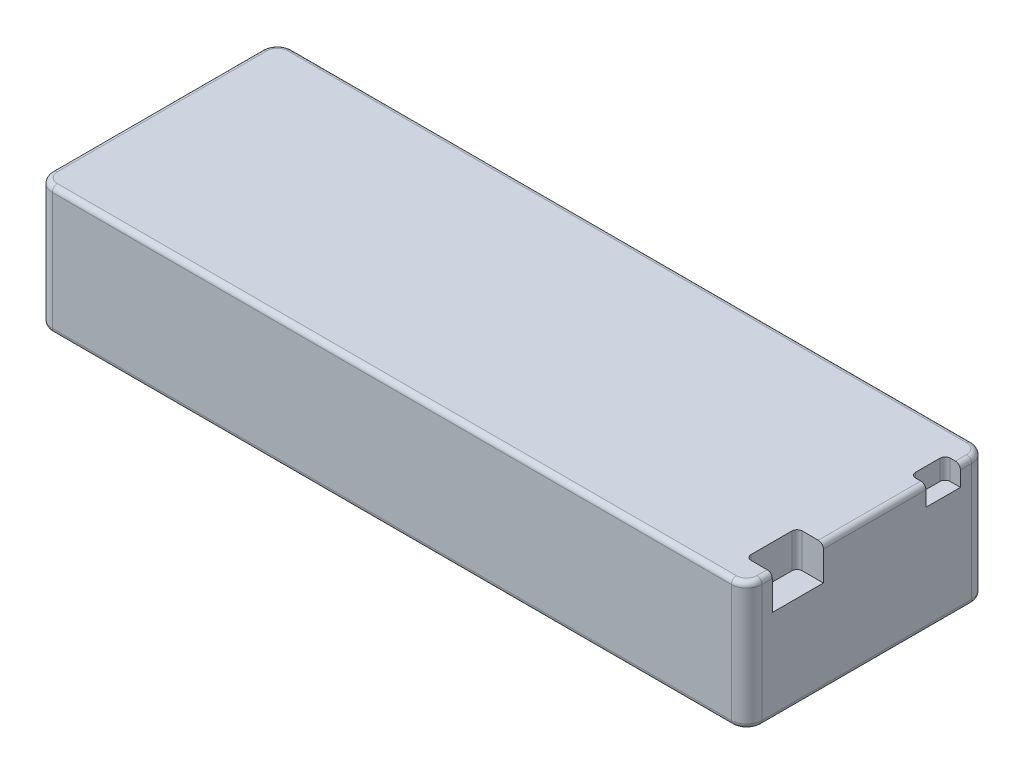
ISO-10303-21;
HEADER;
FILE_DESCRIPTION(('STEP AP214'),'2;1');
FILE_NAME('part.step','',(''),(''),'','','');
FILE_SCHEMA(('AUTOMOTIVE_DESIGN { 1 0 10303 214 1 1 1 1 }'));
ENDSEC;
DATA;
#1=APPLICATION_CONTEXT('core data for automotive mechanical design processes');
#2=APPLICATION_PROTOCOL_DEFINITION('international standard','automotive_design',2000,#1);
#3=PRODUCT_CONTEXT('',#1,'mechanical');
#4=PRODUCT('Part','Part','',(#3));
#5=PRODUCT_RELATED_PRODUCT_CATEGORY('part','',(#4));
#6=PRODUCT_DEFINITION_FORMATION('','',#4);
#7=PRODUCT_DEFINITION_CONTEXT('part definition',#1,'design');
#8=PRODUCT_DEFINITION('design','',#6,#7);
#9=PRODUCT_DEFINITION_SHAPE('','',#8);
#10=(LENGTH_UNIT() NAMED_UNIT(*) SI_UNIT(.MILLI.,.METRE.));
#11=(NAMED_UNIT(*) PLANE_ANGLE_UNIT() SI_UNIT($,.RADIAN.));
#12=(NAMED_UNIT(*) SI_UNIT($,.STERADIAN.) SOLID_ANGLE_UNIT());
#13=UNCERTAINTY_MEASURE_WITH_UNIT(LENGTH_MEASURE(1.E-05),#10,'distance_accuracy_value','');
#14=(GEOMETRIC_REPRESENTATION_CONTEXT(3) GLOBAL_UNCERTAINTY_ASSIGNED_CONTEXT((#13)) GLOBAL_UNIT_ASSIGNED_CONTEXT((#10,
#11,#12)) REPRESENTATION_CONTEXT('',''));
#15=CARTESIAN_POINT('',(0.,0.,0.));
#16=DIRECTION('',(0.,0.,1.));
#17=DIRECTION('',(1.,0.,0.));
#18=AXIS2_PLACEMENT_3D('',#15,#16,#17);
#19=CARTESIAN_POINT('',(-69.4,25.,23.5));
#20=DIRECTION('',(0.,0.,-1.));
#21=DIRECTION('',(-1.,0.,0.));
#22=AXIS2_PLACEMENT_3D('',#19,#20,#21);
#23=PLANE('',#22);
#24=DIRECTION('',(0.,-1.,0.));
#25=VECTOR('',#24,1.);
#26=CARTESIAN_POINT('',(-66.4,0.,23.5));
#27=LINE('',#26,#25);
#28=CARTESIAN_POINT('',(-66.4,24.,23.5));
#29=VERTEX_POINT('',#28);
#30=CARTESIAN_POINT('',(-66.4,1.,23.5));
#31=VERTEX_POINT('',#30);
#32=EDGE_CURVE('E343',#29,#31,#27,.T.);
#33=ORIENTED_EDGE('',*,*,#32,.T.);
#34=DIRECTION('',(1.,0.,0.));
#35=VECTOR('',#34,1.);
#36=CARTESIAN_POINT('',(-69.4,1.,23.5));
#37=LINE('',#36,#35);
#38=CARTESIAN_POINT('',(66.4,1.,23.5));
#39=VERTEX_POINT('',#38);
#40=EDGE_CURVE('E474',#31,#39,#37,.T.);
#41=ORIENTED_EDGE('',*,*,#40,.T.);
#42=DIRECTION('',(0.,-1.,0.));
#43=VECTOR('',#42,1.);
#44=CARTESIAN_POINT('',(66.4,25.,23.5));
#45=LINE('',#44,#43);
#46=CARTESIAN_POINT('',(66.4,24.,23.5));
#47=VERTEX_POINT('',#46);
#48=EDGE_CURVE('E347',#39,#47,#45,.F.);
#49=ORIENTED_EDGE('',*,*,#48,.T.);
#50=DIRECTION('',(1.,0.,0.));
#51=VECTOR('',#50,1.);
#52=CARTESIAN_POINT('',(-66.4,24.,23.5));
#53=LINE('',#52,#51);
#54=EDGE_CURVE('E471',#47,#29,#53,.F.);
#55=ORIENTED_EDGE('',*,*,#54,.T.);
#56=EDGE_LOOP('',(#33,#41,#49,#55));
#57=FACE_BOUND('',#56,.T.);
#58=ADVANCED_FACE('F47',(#57),#23,.F.);
#59=CARTESIAN_POINT('',(69.4,25.,23.5));
#60=DIRECTION('',(-1.,0.,0.));
#61=DIRECTION('',(0.,0.,1.));
#62=AXIS2_PLACEMENT_3D('',#59,#60,#61);
#63=PLANE('',#62);
#64=DIRECTION('',(0.,-1.,0.));
#65=VECTOR('',#64,1.);
#66=CARTESIAN_POINT('',(69.4,25.,20.5));
#67=LINE('',#66,#65);
#68=CARTESIAN_POINT('',(69.4,24.,20.5));
#69=VERTEX_POINT('',#68);
#70=CARTESIAN_POINT('',(69.4,1.,20.5));
#71=VERTEX_POINT('',#70);
#72=EDGE_CURVE('E336',#69,#71,#67,.T.);
#73=ORIENTED_EDGE('',*,*,#72,.T.);
#74=DIRECTION('',(0.,0.,-1.));
#75=VECTOR('',#74,1.);
#76=CARTESIAN_POINT('',(69.4,1.,23.5));
#77=LINE('',#76,#75);
#78=CARTESIAN_POINT('',(69.4,1.,-20.5));
#79=VERTEX_POINT('',#78);
#80=EDGE_CURVE('E416',#71,#79,#77,.T.);
#81=ORIENTED_EDGE('',*,*,#80,.T.);
#82=DIRECTION('',(0.,-1.,0.));
#83=VECTOR('',#82,1.);
#84=CARTESIAN_POINT('',(69.4,25.,-20.5));
#85=LINE('',#84,#83);
#86=CARTESIAN_POINT('',(69.4,24.,-20.5));
#87=VERTEX_POINT('',#86);
#88=EDGE_CURVE('E339',#79,#87,#85,.F.);
#89=ORIENTED_EDGE('',*,*,#88,.T.);
#90=DIRECTION('',(0.,0.,-1.));
#91=VECTOR('',#90,1.);
#92=CARTESIAN_POINT('',(69.4,24.,-18.3));
#93=LINE('',#92,#91);
#94=CARTESIAN_POINT('',(69.4,24.,-18.3));
#95=VERTEX_POINT('',#94);
#96=EDGE_CURVE('E413',#87,#95,#93,.F.);
#97=ORIENTED_EDGE('',*,*,#96,.T.);
#98=DIRECTION('',(0.,1.,0.));
#99=VECTOR('',#98,1.);
#100=CARTESIAN_POINT('',(69.4,25.,-18.3));
#101=LINE('',#100,#99);
#102=CARTESIAN_POINT('',(69.4,21.05,-18.3));
#103=VERTEX_POINT('',#102);
#104=EDGE_CURVE('E272',#103,#95,#101,.T.);
#105=ORIENTED_EDGE('',*,*,#104,.F.);
#106=DIRECTION('',(0.,0.,-1.));
#107=VECTOR('',#106,1.);
#108=CARTESIAN_POINT('',(69.4,21.05,-11.55));
#109=LINE('',#108,#107);
#110=CARTESIAN_POINT('',(69.4,21.05,-11.55));
#111=VERTEX_POINT('',#110);
#112=EDGE_CURVE('E250',#111,#103,#109,.T.);
#113=ORIENTED_EDGE('',*,*,#112,.F.);
#114=DIRECTION('',(0.,-1.,0.));
#115=VECTOR('',#114,1.);
#116=CARTESIAN_POINT('',(69.4,25.,-11.55));
#117=LINE('',#116,#115);
#118=CARTESIAN_POINT('',(69.4,24.,-11.55));
#119=VERTEX_POINT('',#118);
#120=EDGE_CURVE('E260',#119,#111,#117,.T.);
#121=ORIENTED_EDGE('',*,*,#120,.F.);
#122=DIRECTION('',(0.,0.,-1.));
#123=VECTOR('',#122,1.);
#124=CARTESIAN_POINT('',(69.4,24.,8.49999999999999));
#125=LINE('',#124,#123);
#126=CARTESIAN_POINT('',(69.4,24.,8.49999999999999));
#127=VERTEX_POINT('',#126);
#128=EDGE_CURVE('E407',#119,#127,#125,.F.);
#129=ORIENTED_EDGE('',*,*,#128,.T.);
#130=DIRECTION('',(0.,1.,0.));
#131=VECTOR('',#130,1.);
#132=CARTESIAN_POINT('',(69.4,25.,8.49999999999999));
#133=LINE('',#132,#131);
#134=CARTESIAN_POINT('',(69.4,18.25,8.49999999999999));
#135=VERTEX_POINT('',#134);
#136=EDGE_CURVE('E294',#135,#127,#133,.T.);
#137=ORIENTED_EDGE('',*,*,#136,.F.);
#138=DIRECTION('',(0.,0.,-1.));
#139=VECTOR('',#138,1.);
#140=CARTESIAN_POINT('',(69.4,18.25,18.5));
#141=LINE('',#140,#139);
#142=CARTESIAN_POINT('',(69.4,18.25,18.5));
#143=VERTEX_POINT('',#142);
#144=EDGE_CURVE('E302',#143,#135,#141,.T.);
#145=ORIENTED_EDGE('',*,*,#144,.F.);
#146=DIRECTION('',(0.,-1.,0.));
#147=VECTOR('',#146,1.);
#148=CARTESIAN_POINT('',(69.4,25.,18.5));
#149=LINE('',#148,#147);
#150=CARTESIAN_POINT('',(69.4,24.,18.5));
#151=VERTEX_POINT('',#150);
#152=EDGE_CURVE('E283',#151,#143,#149,.T.);
#153=ORIENTED_EDGE('',*,*,#152,.F.);
#154=DIRECTION('',(0.,0.,-1.));
#155=VECTOR('',#154,1.);
#156=CARTESIAN_POINT('',(69.4,24.,20.5));
#157=LINE('',#156,#155);
#158=EDGE_CURVE('E410',#151,#69,#157,.F.);
#159=ORIENTED_EDGE('',*,*,#158,.T.);
#160=EDGE_LOOP('',(#73,#81,#89,#97,#105,#113,#121,#129,#137,#145,#153,#159));
#161=FACE_BOUND('',#160,.T.);
#162=ADVANCED_FACE('F270',(#161),#63,.F.);
#163=CARTESIAN_POINT('',(-69.4,25.,-23.5));
#164=DIRECTION('',(0.,0.,-1.));
#165=DIRECTION('',(-1.,0.,0.));
#166=AXIS2_PLACEMENT_3D('',#163,#164,#165);
#167=PLANE('',#166);
#168=DIRECTION('',(0.,-1.,0.));
#169=VECTOR('',#168,1.);
#170=CARTESIAN_POINT('',(66.4,0.,-23.5));
#171=LINE('',#170,#169);
#172=CARTESIAN_POINT('',(66.4,24.,-23.5));
#173=VERTEX_POINT('',#172);
#174=CARTESIAN_POINT('',(66.4,1.,-23.5));
#175=VERTEX_POINT('',#174);
#176=EDGE_CURVE('E328',#173,#175,#171,.T.);
#177=ORIENTED_EDGE('',*,*,#176,.T.);
#178=DIRECTION('',(1.,0.,0.));
#179=VECTOR('',#178,1.);
#180=CARTESIAN_POINT('',(-66.4,1.,-23.5));
#181=LINE('',#180,#179);
#182=CARTESIAN_POINT('',(-66.4,1.,-23.5));
#183=VERTEX_POINT('',#182);
#184=EDGE_CURVE('E398',#175,#183,#181,.F.);
#185=ORIENTED_EDGE('',*,*,#184,.T.);
#186=DIRECTION('',(0.,-1.,0.));
#187=VECTOR('',#186,1.);
#188=CARTESIAN_POINT('',(-66.4,25.,-23.5));
#189=LINE('',#188,#187);
#190=CARTESIAN_POINT('',(-66.4,24.,-23.5));
#191=VERTEX_POINT('',#190);
#192=EDGE_CURVE('E332',#183,#191,#189,.F.);
#193=ORIENTED_EDGE('',*,*,#192,.T.);
#194=DIRECTION('',(1.,0.,0.));
#195=VECTOR('',#194,1.);
#196=CARTESIAN_POINT('',(-69.4,24.,-23.5));
#197=LINE('',#196,#195);
#198=EDGE_CURVE('E395',#191,#173,#197,.T.);
#199=ORIENTED_EDGE('',*,*,#198,.T.);
#200=EDGE_LOOP('',(#177,#185,#193,#199));
#201=FACE_BOUND('',#200,.T.);
#202=ADVANCED_FACE('F667',(#201),#167,.T.);
#203=CARTESIAN_POINT('',(-69.4,25.,23.5));
#204=DIRECTION('',(-1.,0.,0.));
#205=DIRECTION('',(0.,0.,1.));
#206=AXIS2_PLACEMENT_3D('',#203,#204,#205);
#207=PLANE('',#206);
#208=DIRECTION('',(0.,-1.,0.));
#209=VECTOR('',#208,1.);
#210=CARTESIAN_POINT('',(-69.4,25.,-20.5));
#211=LINE('',#210,#209);
#212=CARTESIAN_POINT('',(-69.4,24.,-20.5));
#213=VERTEX_POINT('',#212);
#214=CARTESIAN_POINT('',(-69.4,1.,-20.5));
#215=VERTEX_POINT('',#214);
#216=EDGE_CURVE('E324',#213,#215,#211,.T.);
#217=ORIENTED_EDGE('',*,*,#216,.T.);
#218=DIRECTION('',(0.,0.,-1.));
#219=VECTOR('',#218,1.);
#220=CARTESIAN_POINT('',(-69.4,1.,20.5));
#221=LINE('',#220,#219);
#222=CARTESIAN_POINT('',(-69.4,1.,20.5));
#223=VERTEX_POINT('',#222);
#224=EDGE_CURVE('E386',#215,#223,#221,.F.);
#225=ORIENTED_EDGE('',*,*,#224,.T.);
#226=DIRECTION('',(0.,-1.,0.));
#227=VECTOR('',#226,1.);
#228=CARTESIAN_POINT('',(-69.4,25.,20.5));
#229=LINE('',#228,#227);
#230=CARTESIAN_POINT('',(-69.4,24.,20.5));
#231=VERTEX_POINT('',#230);
#232=EDGE_CURVE('E312',#223,#231,#229,.F.);
#233=ORIENTED_EDGE('',*,*,#232,.T.);
#234=DIRECTION('',(0.,0.,-1.));
#235=VECTOR('',#234,1.);
#236=CARTESIAN_POINT('',(-69.4,24.,23.5));
#237=LINE('',#236,#235);
#238=EDGE_CURVE('E383',#231,#213,#237,.T.);
#239=ORIENTED_EDGE('',*,*,#238,.T.);
#240=EDGE_LOOP('',(#217,#225,#233,#239));
#241=FACE_BOUND('',#240,.T.);
#242=ADVANCED_FACE('F917',(#241),#207,.T.);
#243=CARTESIAN_POINT('',(0.,25.,0.));
#244=DIRECTION('',(0.,1.,0.));
#245=DIRECTION('',(0.,0.,1.));
#246=AXIS2_PLACEMENT_3D('',#243,#244,#245);
#247=PLANE('',#246);
#248=DIRECTION('',(0.,0.,1.));
#249=VECTOR('',#248,1.);
#250=CARTESIAN_POINT('',(64.25,25.,18.5));
#251=LINE('',#250,#249);
#252=CARTESIAN_POINT('',(64.25,25.,9.49999999999999));
#253=VERTEX_POINT('',#252);
#254=CARTESIAN_POINT('',(64.25,25.,17.5));
#255=VERTEX_POINT('',#254);
#256=EDGE_CURVE('E293',#253,#255,#251,.T.);
#257=ORIENTED_EDGE('',*,*,#256,.F.);
#258=CARTESIAN_POINT('',(65.25,25.,9.49999999999999));
#259=DIRECTION('',(0.,1.,0.));
#260=DIRECTION('',(0.,0.,1.));
#261=AXIS2_PLACEMENT_3D('',#258,#259,#260);
#262=CIRCLE('',#261,1.);
#263=CARTESIAN_POINT('',(65.25,25.,8.49999999999999));
#264=VERTEX_POINT('',#263);
#265=EDGE_CURVE('E56',#253,#264,#262,.F.);
#266=ORIENTED_EDGE('',*,*,#265,.T.);
#267=DIRECTION('',(1.,0.,0.));
#268=VECTOR('',#267,1.);
#269=CARTESIAN_POINT('',(64.25,25.,8.49999999999999));
#270=LINE('',#269,#268);
#271=CARTESIAN_POINT('',(68.4,25.,8.49999999999999));
#272=VERTEX_POINT('',#271);
#273=EDGE_CURVE('E313',#264,#272,#270,.T.);
#274=ORIENTED_EDGE('',*,*,#273,.T.);
#275=DIRECTION('',(0.,0.,-1.));
#276=VECTOR('',#275,1.);
#277=CARTESIAN_POINT('',(68.4,25.,-11.55));
#278=LINE('',#277,#276);
#279=CARTESIAN_POINT('',(68.4,25.,-11.55));
#280=VERTEX_POINT('',#279);
#281=EDGE_CURVE('E454',#272,#280,#278,.T.);
#282=ORIENTED_EDGE('',*,*,#281,.T.);
#283=DIRECTION('',(1.,0.,0.));
#284=VECTOR('',#283,1.);
#285=CARTESIAN_POINT('',(66.4,25.,-11.55));
#286=LINE('',#285,#284);
#287=CARTESIAN_POINT('',(67.4,25.,-11.55));
#288=VERTEX_POINT('',#287);
#289=EDGE_CURVE('E280',#288,#280,#286,.T.);
#290=ORIENTED_EDGE('',*,*,#289,.F.);
#291=CARTESIAN_POINT('',(67.4,25.,-12.55));
#292=DIRECTION('',(0.,1.,0.));
#293=DIRECTION('',(0.,0.,1.));
#294=AXIS2_PLACEMENT_3D('',#291,#292,#293);
#295=CIRCLE('',#294,1.);
#296=CARTESIAN_POINT('',(66.4,25.,-12.55));
#297=VERTEX_POINT('',#296);
#298=EDGE_CURVE('E574',#288,#297,#295,.F.);
#299=ORIENTED_EDGE('',*,*,#298,.T.);
#300=DIRECTION('',(0.,0.,1.));
#301=VECTOR('',#300,1.);
#302=CARTESIAN_POINT('',(66.4,25.,-11.55));
#303=LINE('',#302,#301);
#304=CARTESIAN_POINT('',(66.4,25.,-17.3));
#305=VERTEX_POINT('',#304);
#306=EDGE_CURVE('E257',#305,#297,#303,.T.);
#307=ORIENTED_EDGE('',*,*,#306,.F.);
#308=CARTESIAN_POINT('',(67.4,25.,-17.3));
#309=DIRECTION('',(0.,1.,0.));
#310=DIRECTION('',(0.,0.,1.));
#311=AXIS2_PLACEMENT_3D('',#308,#309,#310);
#312=CIRCLE('',#311,1.);
#313=CARTESIAN_POINT('',(67.4,25.,-18.3));
#314=VERTEX_POINT('',#313);
#315=EDGE_CURVE('E577',#305,#314,#312,.F.);
#316=ORIENTED_EDGE('',*,*,#315,.T.);
#317=DIRECTION('',(1.,0.,0.));
#318=VECTOR('',#317,1.);
#319=CARTESIAN_POINT('',(66.4,25.,-18.3));
#320=LINE('',#319,#318);
#321=CARTESIAN_POINT('',(68.4,25.,-18.3));
#322=VERTEX_POINT('',#321);
#323=EDGE_CURVE('E284',#314,#322,#320,.T.);
#324=ORIENTED_EDGE('',*,*,#323,.T.);
#325=DIRECTION('',(0.,0.,-1.));
#326=VECTOR('',#325,1.);
#327=CARTESIAN_POINT('',(68.4,25.,-20.5));
#328=LINE('',#327,#326);
#329=CARTESIAN_POINT('',(68.4,25.,-20.5));
#330=VERTEX_POINT('',#329);
#331=EDGE_CURVE('E450',#322,#330,#328,.T.);
#332=ORIENTED_EDGE('',*,*,#331,.T.);
#333=CARTESIAN_POINT('',(66.4,25.,-20.5));
#334=DIRECTION('',(0.,1.,0.));
#335=DIRECTION('',(0.,0.,1.));
#336=AXIS2_PLACEMENT_3D('',#333,#334,#335);
#337=CIRCLE('',#336,2.);
#338=CARTESIAN_POINT('',(66.4,25.,-22.5));
#339=VERTEX_POINT('',#338);
#340=EDGE_CURVE('E447',#330,#339,#337,.T.);
#341=ORIENTED_EDGE('',*,*,#340,.T.);
#342=DIRECTION('',(1.,0.,0.));
#343=VECTOR('',#342,1.);
#344=CARTESIAN_POINT('',(0.,25.,-22.5));
#345=LINE('',#344,#343);
#346=CARTESIAN_POINT('',(-66.4,25.,-22.5));
#347=VERTEX_POINT('',#346);
#348=EDGE_CURVE('E444',#339,#347,#345,.F.);
#349=ORIENTED_EDGE('',*,*,#348,.T.);
#350=CARTESIAN_POINT('',(-66.4,25.,-20.5));
#351=DIRECTION('',(0.,1.,0.));
#352=DIRECTION('',(0.,0.,1.));
#353=AXIS2_PLACEMENT_3D('',#350,#351,#352);
#354=CIRCLE('',#353,2.);
#355=CARTESIAN_POINT('',(-68.4,25.,-20.5));
#356=VERTEX_POINT('',#355);
#357=EDGE_CURVE('E441',#347,#356,#354,.T.);
#358=ORIENTED_EDGE('',*,*,#357,.T.);
#359=DIRECTION('',(0.,0.,-1.));
#360=VECTOR('',#359,1.);
#361=CARTESIAN_POINT('',(-68.4,25.,0.));
#362=LINE('',#361,#360);
#363=CARTESIAN_POINT('',(-68.4,25.,20.5));
#364=VERTEX_POINT('',#363);
#365=EDGE_CURVE('E438',#356,#364,#362,.F.);
#366=ORIENTED_EDGE('',*,*,#365,.T.);
#367=CARTESIAN_POINT('',(-66.4,25.,20.5));
#368=DIRECTION('',(0.,1.,0.));
#369=DIRECTION('',(0.,0.,1.));
#370=AXIS2_PLACEMENT_3D('',#367,#368,#369);
#371=CIRCLE('',#370,2.);
#372=CARTESIAN_POINT('',(-66.4,25.,22.5));
#373=VERTEX_POINT('',#372);
#374=EDGE_CURVE('E435',#364,#373,#371,.T.);
#375=ORIENTED_EDGE('',*,*,#374,.T.);
#376=DIRECTION('',(1.,0.,0.));
#377=VECTOR('',#376,1.);
#378=CARTESIAN_POINT('',(66.4,25.,22.5));
#379=LINE('',#378,#377);
#380=CARTESIAN_POINT('',(66.4,25.,22.5));
#381=VERTEX_POINT('',#380);
#382=EDGE_CURVE('E425',#373,#381,#379,.T.);
#383=ORIENTED_EDGE('',*,*,#382,.T.);
#384=CARTESIAN_POINT('',(66.4,25.,20.5));
#385=DIRECTION('',(0.,1.,0.));
#386=DIRECTION('',(0.,0.,1.));
#387=AXIS2_PLACEMENT_3D('',#384,#385,#386);
#388=CIRCLE('',#387,2.);
#389=CARTESIAN_POINT('',(68.4,25.,20.5));
#390=VERTEX_POINT('',#389);
#391=EDGE_CURVE('E428',#381,#390,#388,.T.);
#392=ORIENTED_EDGE('',*,*,#391,.T.);
#393=DIRECTION('',(0.,0.,-1.));
#394=VECTOR('',#393,1.);
#395=CARTESIAN_POINT('',(68.4,25.,18.5));
#396=LINE('',#395,#394);
#397=CARTESIAN_POINT('',(68.4,25.,18.5));
#398=VERTEX_POINT('',#397);
#399=EDGE_CURVE('E431',#390,#398,#396,.T.);
#400=ORIENTED_EDGE('',*,*,#399,.T.);
#401=DIRECTION('',(1.,0.,0.));
#402=VECTOR('',#401,1.);
#403=CARTESIAN_POINT('',(64.25,25.,18.5));
#404=LINE('',#403,#402);
#405=CARTESIAN_POINT('',(65.25,25.,18.5));
#406=VERTEX_POINT('',#405);
#407=EDGE_CURVE('E309',#406,#398,#404,.T.);
#408=ORIENTED_EDGE('',*,*,#407,.F.);
#409=CARTESIAN_POINT('',(65.25,25.,17.5));
#410=DIRECTION('',(0.,1.,0.));
#411=DIRECTION('',(0.,0.,1.));
#412=AXIS2_PLACEMENT_3D('',#409,#410,#411);
#413=CIRCLE('',#412,1.);
#414=EDGE_CURVE('E11',#406,#255,#413,.F.);
#415=ORIENTED_EDGE('',*,*,#414,.T.);
#416=EDGE_LOOP('',(#257,#266,#274,#282,#290,#299,#307,#316,#324,#332,#341,#349,#358,#366,#375,
#383,#392,#400,#408,#415));
#417=FACE_BOUND('',#416,.T.);
#418=ADVANCED_FACE('F583',(#417),#247,.T.);
#419=CARTESIAN_POINT('',(0.,0.,0.));
#420=DIRECTION('',(0.,1.,0.));
#421=DIRECTION('',(0.,0.,1.));
#422=AXIS2_PLACEMENT_3D('',#419,#420,#421);
#423=PLANE('',#422);
#424=DIRECTION('',(1.,0.,0.));
#425=VECTOR('',#424,1.);
#426=CARTESIAN_POINT('',(0.,0.,22.5));
#427=LINE('',#426,#425);
#428=CARTESIAN_POINT('',(66.4,0.,22.5));
#429=VERTEX_POINT('',#428);
#430=CARTESIAN_POINT('',(-66.4,0.,22.5));
#431=VERTEX_POINT('',#430);
#432=EDGE_CURVE('E351',#429,#431,#427,.F.);
#433=ORIENTED_EDGE('',*,*,#432,.T.);
#434=CARTESIAN_POINT('',(-66.4,0.,20.5));
#435=DIRECTION('',(0.,1.,0.));
#436=DIRECTION('',(0.,0.,1.));
#437=AXIS2_PLACEMENT_3D('',#434,#435,#436);
#438=CIRCLE('',#437,2.);
#439=CARTESIAN_POINT('',(-68.4,0.,20.5));
#440=VERTEX_POINT('',#439);
#441=EDGE_CURVE('E372',#431,#440,#438,.F.);
#442=ORIENTED_EDGE('',*,*,#441,.T.);
#443=DIRECTION('',(0.,0.,-1.));
#444=VECTOR('',#443,1.);
#445=CARTESIAN_POINT('',(-68.4,0.,-20.5));
#446=LINE('',#445,#444);
#447=CARTESIAN_POINT('',(-68.4,0.,-20.5));
#448=VERTEX_POINT('',#447);
#449=EDGE_CURVE('E369',#440,#448,#446,.T.);
#450=ORIENTED_EDGE('',*,*,#449,.T.);
#451=CARTESIAN_POINT('',(-66.4,0.,-20.5));
#452=DIRECTION('',(0.,1.,0.));
#453=DIRECTION('',(0.,0.,1.));
#454=AXIS2_PLACEMENT_3D('',#451,#452,#453);
#455=CIRCLE('',#454,2.);
#456=CARTESIAN_POINT('',(-66.4,0.,-22.5));
#457=VERTEX_POINT('',#456);
#458=EDGE_CURVE('E366',#448,#457,#455,.F.);
#459=ORIENTED_EDGE('',*,*,#458,.T.);
#460=DIRECTION('',(1.,0.,0.));
#461=VECTOR('',#460,1.);
#462=CARTESIAN_POINT('',(66.4,0.,-22.5));
#463=LINE('',#462,#461);
#464=CARTESIAN_POINT('',(66.4,0.,-22.5));
#465=VERTEX_POINT('',#464);
#466=EDGE_CURVE('E363',#457,#465,#463,.T.);
#467=ORIENTED_EDGE('',*,*,#466,.T.);
#468=CARTESIAN_POINT('',(66.4,0.,-20.5));
#469=DIRECTION('',(0.,1.,0.));
#470=DIRECTION('',(0.,0.,1.));
#471=AXIS2_PLACEMENT_3D('',#468,#469,#470);
#472=CIRCLE('',#471,2.);
#473=CARTESIAN_POINT('',(68.4,0.,-20.5));
#474=VERTEX_POINT('',#473);
#475=EDGE_CURVE('E360',#465,#474,#472,.F.);
#476=ORIENTED_EDGE('',*,*,#475,.T.);
#477=DIRECTION('',(0.,0.,-1.));
#478=VECTOR('',#477,1.);
#479=CARTESIAN_POINT('',(68.4,0.,0.));
#480=LINE('',#479,#478);
#481=CARTESIAN_POINT('',(68.4,0.,20.5));
#482=VERTEX_POINT('',#481);
#483=EDGE_CURVE('E357',#474,#482,#480,.F.);
#484=ORIENTED_EDGE('',*,*,#483,.T.);
#485=CARTESIAN_POINT('',(66.4,0.,20.5));
#486=DIRECTION('',(0.,1.,0.));
#487=DIRECTION('',(0.,0.,1.));
#488=AXIS2_PLACEMENT_3D('',#485,#486,#487);
#489=CIRCLE('',#488,2.);
#490=EDGE_CURVE('E354',#482,#429,#489,.F.);
#491=ORIENTED_EDGE('',*,*,#490,.T.);
#492=EDGE_LOOP('',(#433,#442,#450,#459,#467,#476,#484,#491));
#493=FACE_BOUND('',#492,.T.);
#494=ADVANCED_FACE('F645',(#493),#423,.F.);
#495=CARTESIAN_POINT('',(64.25,25.,18.5));
#496=DIRECTION('',(0.,0.,1.));
#497=DIRECTION('',(1.,0.,0.));
#498=AXIS2_PLACEMENT_3D('',#495,#496,#497);
#499=PLANE('',#498);
#500=DIRECTION('',(1.,0.,0.));
#501=VECTOR('',#500,1.);
#502=CARTESIAN_POINT('',(64.25,18.25,18.5));
#503=LINE('',#502,#501);
#504=CARTESIAN_POINT('',(65.25,18.25,18.5));
#505=VERTEX_POINT('',#504);
#506=EDGE_CURVE('E298',#505,#143,#503,.T.);
#507=ORIENTED_EDGE('',*,*,#506,.F.);
#508=DIRECTION('',(0.,-1.,0.));
#509=VECTOR('',#508,1.);
#510=CARTESIAN_POINT('',(65.25,25.,18.5));
#511=LINE('',#510,#509);
#512=EDGE_CURVE('E63',#505,#406,#511,.F.);
#513=ORIENTED_EDGE('',*,*,#512,.T.);
#514=ORIENTED_EDGE('',*,*,#407,.T.);
#515=CARTESIAN_POINT('',(68.4,24.,18.5));
#516=DIRECTION('',(0.,0.,1.));
#517=DIRECTION('',(1.,0.,0.));
#518=AXIS2_PLACEMENT_3D('',#515,#516,#517);
#519=CIRCLE('',#518,1.);
#520=EDGE_CURVE('E462',#398,#151,#519,.F.);
#521=ORIENTED_EDGE('',*,*,#520,.T.);
#522=ORIENTED_EDGE('',*,*,#152,.T.);
#523=EDGE_LOOP('',(#507,#513,#514,#521,#522));
#524=FACE_BOUND('',#523,.T.);
#525=ADVANCED_FACE('F602',(#524),#499,.F.);
#526=CARTESIAN_POINT('',(64.25,25.,8.49999999999999));
#527=DIRECTION('',(0.,0.,-1.));
#528=DIRECTION('',(-1.,0.,0.));
#529=AXIS2_PLACEMENT_3D('',#526,#527,#528);
#530=PLANE('',#529);
#531=ORIENTED_EDGE('',*,*,#273,.F.);
#532=DIRECTION('',(0.,1.,0.));
#533=VECTOR('',#532,1.);
#534=CARTESIAN_POINT('',(65.25,25.,8.49999999999999));
#535=LINE('',#534,#533);
#536=CARTESIAN_POINT('',(65.25,18.25,8.49999999999999));
#537=VERTEX_POINT('',#536);
#538=EDGE_CURVE('E564',#264,#537,#535,.F.);
#539=ORIENTED_EDGE('',*,*,#538,.T.);
#540=DIRECTION('',(1.,0.,0.));
#541=VECTOR('',#540,1.);
#542=CARTESIAN_POINT('',(64.25,18.25,8.49999999999999));
#543=LINE('',#542,#541);
#544=EDGE_CURVE('E316',#537,#135,#543,.T.);
#545=ORIENTED_EDGE('',*,*,#544,.T.);
#546=ORIENTED_EDGE('',*,*,#136,.T.);
#547=CARTESIAN_POINT('',(68.4,24.,8.49999999999999));
#548=DIRECTION('',(0.,0.,-1.));
#549=DIRECTION('',(-1.,0.,0.));
#550=AXIS2_PLACEMENT_3D('',#547,#548,#549);
#551=CIRCLE('',#550,1.);
#552=EDGE_CURVE('E467',#127,#272,#551,.F.);
#553=ORIENTED_EDGE('',*,*,#552,.T.);
#554=EDGE_LOOP('',(#531,#539,#545,#546,#553));
#555=FACE_BOUND('',#554,.T.);
#556=ADVANCED_FACE('F588',(#555),#530,.F.);
#557=CARTESIAN_POINT('',(64.25,18.25,18.5));
#558=DIRECTION('',(0.,-1.,0.));
#559=DIRECTION('',(0.,0.,-1.));
#560=AXIS2_PLACEMENT_3D('',#557,#558,#559);
#561=PLANE('',#560);
#562=ORIENTED_EDGE('',*,*,#544,.F.);
#563=CARTESIAN_POINT('',(65.25,18.25,9.49999999999999));
#564=DIRECTION('',(0.,-1.,0.));
#565=DIRECTION('',(0.,0.,-1.));
#566=AXIS2_PLACEMENT_3D('',#563,#564,#565);
#567=CIRCLE('',#566,1.);
#568=CARTESIAN_POINT('',(64.25,18.25,9.49999999999999));
#569=VERTEX_POINT('',#568);
#570=EDGE_CURVE('E569',#537,#569,#567,.F.);
#571=ORIENTED_EDGE('',*,*,#570,.T.);
#572=DIRECTION('',(0.,0.,-1.));
#573=VECTOR('',#572,1.);
#574=CARTESIAN_POINT('',(64.25,18.25,18.5));
#575=LINE('',#574,#573);
#576=CARTESIAN_POINT('',(64.25,18.25,17.5));
#577=VERTEX_POINT('',#576);
#578=EDGE_CURVE('E289',#577,#569,#575,.T.);
#579=ORIENTED_EDGE('',*,*,#578,.F.);
#580=CARTESIAN_POINT('',(65.25,18.25,17.5));
#581=DIRECTION('',(0.,-1.,0.));
#582=DIRECTION('',(0.,0.,-1.));
#583=AXIS2_PLACEMENT_3D('',#580,#581,#582);
#584=CIRCLE('',#583,1.);
#585=EDGE_CURVE('E71',#577,#505,#584,.F.);
#586=ORIENTED_EDGE('',*,*,#585,.T.);
#587=ORIENTED_EDGE('',*,*,#506,.T.);
#588=ORIENTED_EDGE('',*,*,#144,.T.);
#589=EDGE_LOOP('',(#562,#571,#579,#586,#587,#588));
#590=FACE_BOUND('',#589,.T.);
#591=ADVANCED_FACE('F594',(#590),#561,.F.);
#592=CARTESIAN_POINT('',(64.25,0.,0.));
#593=DIRECTION('',(1.,0.,0.));
#594=DIRECTION('',(0.,0.,-1.));
#595=AXIS2_PLACEMENT_3D('',#592,#593,#594);
#596=PLANE('',#595);
#597=ORIENTED_EDGE('',*,*,#578,.T.);
#598=DIRECTION('',(0.,1.,0.));
#599=VECTOR('',#598,1.);
#600=CARTESIAN_POINT('',(64.25,0.,9.49999999999999));
#601=LINE('',#600,#599);
#602=EDGE_CURVE('E560',#569,#253,#601,.T.);
#603=ORIENTED_EDGE('',*,*,#602,.T.);
#604=ORIENTED_EDGE('',*,*,#256,.T.);
#605=DIRECTION('',(0.,-1.,0.));
#606=VECTOR('',#605,1.);
#607=CARTESIAN_POINT('',(64.25,0.,17.5));
#608=LINE('',#607,#606);
#609=EDGE_CURVE('E556',#255,#577,#608,.T.);
#610=ORIENTED_EDGE('',*,*,#609,.T.);
#611=EDGE_LOOP('',(#597,#603,#604,#610));
#612=FACE_BOUND('',#611,.T.);
#613=ADVANCED_FACE('F596',(#612),#596,.T.);
#614=CARTESIAN_POINT('',(66.4,25.,-11.55));
#615=DIRECTION('',(0.,0.,1.));
#616=DIRECTION('',(0.,-1.,0.));
#617=AXIS2_PLACEMENT_3D('',#614,#615,#616);
#618=PLANE('',#617);
#619=DIRECTION('',(1.,0.,0.));
#620=VECTOR('',#619,1.);
#621=CARTESIAN_POINT('',(66.4,21.05,-11.55));
#622=LINE('',#621,#620);
#623=CARTESIAN_POINT('',(67.4,21.05,-11.55));
#624=VERTEX_POINT('',#623);
#625=EDGE_CURVE('E244',#624,#111,#622,.T.);
#626=ORIENTED_EDGE('',*,*,#625,.F.);
#627=DIRECTION('',(0.,-1.,0.));
#628=VECTOR('',#627,1.);
#629=CARTESIAN_POINT('',(67.4,25.,-11.55));
#630=LINE('',#629,#628);
#631=EDGE_CURVE('E550',#624,#288,#630,.F.);
#632=ORIENTED_EDGE('',*,*,#631,.T.);
#633=ORIENTED_EDGE('',*,*,#289,.T.);
#634=CARTESIAN_POINT('',(68.4,24.,-11.55));
#635=DIRECTION('',(0.,0.,1.));
#636=DIRECTION('',(0.,-1.,0.));
#637=AXIS2_PLACEMENT_3D('',#634,#635,#636);
#638=CIRCLE('',#637,1.);
#639=EDGE_CURVE('E263',#280,#119,#638,.F.);
#640=ORIENTED_EDGE('',*,*,#639,.T.);
#641=ORIENTED_EDGE('',*,*,#120,.T.);
#642=EDGE_LOOP('',(#626,#632,#633,#640,#641));
#643=FACE_BOUND('',#642,.T.);
#644=ADVANCED_FACE('F261',(#643),#618,.F.);
#645=CARTESIAN_POINT('',(66.4,25.,-18.3));
#646=DIRECTION('',(0.,0.,-1.));
#647=DIRECTION('',(-1.,0.,0.));
#648=AXIS2_PLACEMENT_3D('',#645,#646,#647);
#649=PLANE('',#648);
#650=ORIENTED_EDGE('',*,*,#323,.F.);
#651=DIRECTION('',(0.,1.,0.));
#652=VECTOR('',#651,1.);
#653=CARTESIAN_POINT('',(67.4,25.,-18.3));
#654=LINE('',#653,#652);
#655=CARTESIAN_POINT('',(67.4,21.05,-18.3));
#656=VERTEX_POINT('',#655);
#657=EDGE_CURVE('E553',#314,#656,#654,.F.);
#658=ORIENTED_EDGE('',*,*,#657,.T.);
#659=DIRECTION('',(1.,0.,0.));
#660=VECTOR('',#659,1.);
#661=CARTESIAN_POINT('',(66.4,21.05,-18.3));
#662=LINE('',#661,#660);
#663=EDGE_CURVE('E256',#656,#103,#662,.T.);
#664=ORIENTED_EDGE('',*,*,#663,.T.);
#665=ORIENTED_EDGE('',*,*,#104,.T.);
#666=CARTESIAN_POINT('',(68.4,24.,-18.3));
#667=DIRECTION('',(0.,0.,-1.));
#668=DIRECTION('',(-1.,0.,0.));
#669=AXIS2_PLACEMENT_3D('',#666,#667,#668);
#670=CIRCLE('',#669,1.);
#671=EDGE_CURVE('E458',#95,#322,#670,.F.);
#672=ORIENTED_EDGE('',*,*,#671,.T.);
#673=EDGE_LOOP('',(#650,#658,#664,#665,#672));
#674=FACE_BOUND('',#673,.T.);
#675=ADVANCED_FACE('F686',(#674),#649,.F.);
#676=CARTESIAN_POINT('',(66.4,21.05,-11.55));
#677=DIRECTION('',(0.,-1.,0.));
#678=DIRECTION('',(0.,0.,-1.));
#679=AXIS2_PLACEMENT_3D('',#676,#677,#678);
#680=PLANE('',#679);
#681=DIRECTION('',(0.,0.,-1.));
#682=VECTOR('',#681,1.);
#683=CARTESIAN_POINT('',(66.4,21.05,-11.55));
#684=LINE('',#683,#682);
#685=CARTESIAN_POINT('',(66.4,21.05,-12.55));
#686=VERTEX_POINT('',#685);
#687=CARTESIAN_POINT('',(66.4,21.05,-17.3));
#688=VERTEX_POINT('',#687);
#689=EDGE_CURVE('E276',#686,#688,#684,.T.);
#690=ORIENTED_EDGE('',*,*,#689,.F.);
#691=CARTESIAN_POINT('',(67.4,21.05,-12.55));
#692=DIRECTION('',(0.,-1.,0.));
#693=DIRECTION('',(0.,0.,-1.));
#694=AXIS2_PLACEMENT_3D('',#691,#692,#693);
#695=CIRCLE('',#694,1.);
#696=EDGE_CURVE('E252',#686,#624,#695,.F.);
#697=ORIENTED_EDGE('',*,*,#696,.T.);
#698=ORIENTED_EDGE('',*,*,#625,.T.);
#699=ORIENTED_EDGE('',*,*,#112,.T.);
#700=ORIENTED_EDGE('',*,*,#663,.F.);
#701=CARTESIAN_POINT('',(67.4,21.05,-17.3));
#702=DIRECTION('',(0.,-1.,0.));
#703=DIRECTION('',(0.,0.,-1.));
#704=AXIS2_PLACEMENT_3D('',#701,#702,#703);
#705=CIRCLE('',#704,1.);
#706=EDGE_CURVE('E545',#656,#688,#705,.F.);
#707=ORIENTED_EDGE('',*,*,#706,.T.);
#708=EDGE_LOOP('',(#690,#697,#698,#699,#700,#707));
#709=FACE_BOUND('',#708,.T.);
#710=ADVANCED_FACE('F247',(#709),#680,.F.);
#711=CARTESIAN_POINT('',(66.4,0.,0.));
#712=DIRECTION('',(1.,0.,0.));
#713=DIRECTION('',(0.,0.,-1.));
#714=AXIS2_PLACEMENT_3D('',#711,#712,#713);
#715=PLANE('',#714);
#716=ORIENTED_EDGE('',*,*,#306,.T.);
#717=DIRECTION('',(0.,-1.,0.));
#718=VECTOR('',#717,1.);
#719=CARTESIAN_POINT('',(66.4,0.,-12.55));
#720=LINE('',#719,#718);
#721=EDGE_CURVE('E541',#297,#686,#720,.T.);
#722=ORIENTED_EDGE('',*,*,#721,.T.);
#723=ORIENTED_EDGE('',*,*,#689,.T.);
#724=DIRECTION('',(0.,1.,0.));
#725=VECTOR('',#724,1.);
#726=CARTESIAN_POINT('',(66.4,0.,-17.3));
#727=LINE('',#726,#725);
#728=EDGE_CURVE('E477',#688,#305,#727,.T.);
#729=ORIENTED_EDGE('',*,*,#728,.T.);
#730=EDGE_LOOP('',(#716,#722,#723,#729));
#731=FACE_BOUND('',#730,.T.);
#732=ADVANCED_FACE('F696',(#731),#715,.T.);
#733=CARTESIAN_POINT('',(-66.4,25.,-20.5));
#734=DIRECTION('',(0.,-1.,0.));
#735=DIRECTION('',(0.,0.,-1.));
#736=AXIS2_PLACEMENT_3D('',#733,#734,#735);
#737=CYLINDRICAL_SURFACE('',#736,3.);
#738=ORIENTED_EDGE('',*,*,#192,.F.);
#739=CARTESIAN_POINT('',(-66.4,1.,-20.5));
#740=DIRECTION('',(0.,1.,0.));
#741=DIRECTION('',(0.,0.,1.));
#742=AXIS2_PLACEMENT_3D('',#739,#740,#741);
#743=CIRCLE('',#742,3.);
#744=EDGE_CURVE('E392',#183,#215,#743,.T.);
#745=ORIENTED_EDGE('',*,*,#744,.T.);
#746=ORIENTED_EDGE('',*,*,#216,.F.);
#747=CARTESIAN_POINT('',(-66.4,24.,-20.5));
#748=DIRECTION('',(0.,1.,0.));
#749=DIRECTION('',(0.,0.,1.));
#750=AXIS2_PLACEMENT_3D('',#747,#748,#749);
#751=CIRCLE('',#750,3.);
#752=EDGE_CURVE('E389',#213,#191,#751,.F.);
#753=ORIENTED_EDGE('',*,*,#752,.T.);
#754=EDGE_LOOP('',(#738,#745,#746,#753));
#755=FACE_BOUND('',#754,.T.);
#756=ADVANCED_FACE('F725',(#755),#737,.T.);
#757=CARTESIAN_POINT('',(66.4,25.,-20.5));
#758=DIRECTION('',(0.,1.,0.));
#759=DIRECTION('',(0.,0.,1.));
#760=AXIS2_PLACEMENT_3D('',#757,#758,#759);
#761=CYLINDRICAL_SURFACE('',#760,3.);
#762=ORIENTED_EDGE('',*,*,#88,.F.);
#763=CARTESIAN_POINT('',(66.4,1.,-20.5));
#764=DIRECTION('',(0.,1.,0.));
#765=DIRECTION('',(0.,0.,1.));
#766=AXIS2_PLACEMENT_3D('',#763,#764,#765);
#767=CIRCLE('',#766,3.);
#768=EDGE_CURVE('E404',#79,#175,#767,.T.);
#769=ORIENTED_EDGE('',*,*,#768,.T.);
#770=ORIENTED_EDGE('',*,*,#176,.F.);
#771=CARTESIAN_POINT('',(66.4,24.,-20.5));
#772=DIRECTION('',(0.,1.,0.));
#773=DIRECTION('',(0.,0.,1.));
#774=AXIS2_PLACEMENT_3D('',#771,#772,#773);
#775=CIRCLE('',#774,3.);
#776=EDGE_CURVE('E401',#173,#87,#775,.F.);
#777=ORIENTED_EDGE('',*,*,#776,.T.);
#778=EDGE_LOOP('',(#762,#769,#770,#777));
#779=FACE_BOUND('',#778,.T.);
#780=ADVANCED_FACE('F664',(#779),#761,.T.);
#781=CARTESIAN_POINT('',(66.4,25.,20.5));
#782=DIRECTION('',(0.,-1.,0.));
#783=DIRECTION('',(0.,0.,-1.));
#784=AXIS2_PLACEMENT_3D('',#781,#782,#783);
#785=CYLINDRICAL_SURFACE('',#784,3.);
#786=ORIENTED_EDGE('',*,*,#48,.F.);
#787=CARTESIAN_POINT('',(66.4,1.,20.5));
#788=DIRECTION('',(0.,1.,0.));
#789=DIRECTION('',(0.,0.,1.));
#790=AXIS2_PLACEMENT_3D('',#787,#788,#789);
#791=CIRCLE('',#790,3.);
#792=EDGE_CURVE('E422',#39,#71,#791,.T.);
#793=ORIENTED_EDGE('',*,*,#792,.T.);
#794=ORIENTED_EDGE('',*,*,#72,.F.);
#795=CARTESIAN_POINT('',(66.4,24.,20.5));
#796=DIRECTION('',(0.,1.,0.));
#797=DIRECTION('',(0.,0.,1.));
#798=AXIS2_PLACEMENT_3D('',#795,#796,#797);
#799=CIRCLE('',#798,3.);
#800=EDGE_CURVE('E419',#69,#47,#799,.F.);
#801=ORIENTED_EDGE('',*,*,#800,.T.);
#802=EDGE_LOOP('',(#786,#793,#794,#801));
#803=FACE_BOUND('',#802,.T.);
#804=ADVANCED_FACE('F619',(#803),#785,.T.);
#805=CARTESIAN_POINT('',(-66.4,25.,20.5));
#806=DIRECTION('',(0.,1.,0.));
#807=DIRECTION('',(0.,0.,1.));
#808=AXIS2_PLACEMENT_3D('',#805,#806,#807);
#809=CYLINDRICAL_SURFACE('',#808,3.);
#810=ORIENTED_EDGE('',*,*,#232,.F.);
#811=CARTESIAN_POINT('',(-66.4,1.,20.5));
#812=DIRECTION('',(0.,1.,0.));
#813=DIRECTION('',(0.,0.,1.));
#814=AXIS2_PLACEMENT_3D('',#811,#812,#813);
#815=CIRCLE('',#814,3.);
#816=EDGE_CURVE('E379',#223,#31,#815,.T.);
#817=ORIENTED_EDGE('',*,*,#816,.T.);
#818=ORIENTED_EDGE('',*,*,#32,.F.);
#819=CARTESIAN_POINT('',(-66.4,24.,20.5));
#820=DIRECTION('',(0.,1.,0.));
#821=DIRECTION('',(0.,0.,1.));
#822=AXIS2_PLACEMENT_3D('',#819,#820,#821);
#823=CIRCLE('',#822,3.);
#824=EDGE_CURVE('E376',#29,#231,#823,.F.);
#825=ORIENTED_EDGE('',*,*,#824,.T.);
#826=EDGE_LOOP('',(#810,#817,#818,#825));
#827=FACE_BOUND('',#826,.T.);
#828=ADVANCED_FACE('F633',(#827),#809,.T.);
#829=CARTESIAN_POINT('',(66.4,1.,-20.5));
#830=DIRECTION('',(0.,1.,0.));
#831=DIRECTION('',(0.,0.,1.));
#832=AXIS2_PLACEMENT_3D('',#829,#830,#831);
#833=TOROIDAL_SURFACE('',#832,2.,1.);
#834=CARTESIAN_POINT('',(66.4,1.,-22.5));
#835=DIRECTION('',(-1.,0.,0.));
#836=DIRECTION('',(0.,0.,1.));
#837=AXIS2_PLACEMENT_3D('',#834,#835,#836);
#838=CIRCLE('',#837,1.);
#839=EDGE_CURVE('E501',#175,#465,#838,.T.);
#840=ORIENTED_EDGE('',*,*,#839,.F.);
#841=ORIENTED_EDGE('',*,*,#768,.F.);
#842=CARTESIAN_POINT('',(68.4,1.,-20.5));
#843=DIRECTION('',(0.,0.,1.));
#844=DIRECTION('',(1.,0.,0.));
#845=AXIS2_PLACEMENT_3D('',#842,#843,#844);
#846=CIRCLE('',#845,1.);
#847=EDGE_CURVE('E267',#474,#79,#846,.T.);
#848=ORIENTED_EDGE('',*,*,#847,.F.);
#849=ORIENTED_EDGE('',*,*,#475,.F.);
#850=EDGE_LOOP('',(#840,#841,#848,#849));
#851=FACE_BOUND('',#850,.T.);
#852=ADVANCED_FACE('F660',(#851),#833,.T.);
#853=CARTESIAN_POINT('',(68.4,1.,23.5));
#854=DIRECTION('',(0.,0.,-1.));
#855=DIRECTION('',(-1.,0.,0.));
#856=AXIS2_PLACEMENT_3D('',#853,#854,#855);
#857=CYLINDRICAL_SURFACE('',#856,1.);
#858=ORIENTED_EDGE('',*,*,#847,.T.);
#859=ORIENTED_EDGE('',*,*,#80,.F.);
#860=CARTESIAN_POINT('',(68.4,1.,20.5));
#861=DIRECTION('',(0.,0.,1.));
#862=DIRECTION('',(1.,0.,0.));
#863=AXIS2_PLACEMENT_3D('',#860,#861,#862);
#864=CIRCLE('',#863,1.);
#865=EDGE_CURVE('E497',#482,#71,#864,.T.);
#866=ORIENTED_EDGE('',*,*,#865,.F.);
#867=ORIENTED_EDGE('',*,*,#483,.F.);
#868=EDGE_LOOP('',(#858,#859,#866,#867));
#869=FACE_BOUND('',#868,.T.);
#870=ADVANCED_FACE('F654',(#869),#857,.T.);
#871=CARTESIAN_POINT('',(0.,1.,-22.5));
#872=DIRECTION('',(-1.,0.,0.));
#873=DIRECTION('',(0.,0.,1.));
#874=AXIS2_PLACEMENT_3D('',#871,#872,#873);
#875=CYLINDRICAL_SURFACE('',#874,1.);
#876=ORIENTED_EDGE('',*,*,#839,.T.);
#877=ORIENTED_EDGE('',*,*,#466,.F.);
#878=CARTESIAN_POINT('',(-66.4,1.,-22.5));
#879=DIRECTION('',(-1.,0.,0.));
#880=DIRECTION('',(0.,0.,1.));
#881=AXIS2_PLACEMENT_3D('',#878,#879,#880);
#882=CIRCLE('',#881,1.);
#883=EDGE_CURVE('E493',#183,#457,#882,.T.);
#884=ORIENTED_EDGE('',*,*,#883,.F.);
#885=ORIENTED_EDGE('',*,*,#184,.F.);
#886=EDGE_LOOP('',(#876,#877,#884,#885));
#887=FACE_BOUND('',#886,.T.);
#888=ADVANCED_FACE('F747',(#887),#875,.T.);
#889=CARTESIAN_POINT('',(66.4,1.,20.5));
#890=DIRECTION('',(0.,1.,0.));
#891=DIRECTION('',(0.,0.,1.));
#892=AXIS2_PLACEMENT_3D('',#889,#890,#891);
#893=TOROIDAL_SURFACE('',#892,2.,1.);
#894=ORIENTED_EDGE('',*,*,#865,.T.);
#895=ORIENTED_EDGE('',*,*,#792,.F.);
#896=CARTESIAN_POINT('',(66.4,1.,22.5));
#897=DIRECTION('',(-1.,0.,0.));
#898=DIRECTION('',(0.,0.,1.));
#899=AXIS2_PLACEMENT_3D('',#896,#897,#898);
#900=CIRCLE('',#899,1.);
#901=EDGE_CURVE('E489',#429,#39,#900,.T.);
#902=ORIENTED_EDGE('',*,*,#901,.F.);
#903=ORIENTED_EDGE('',*,*,#490,.F.);
#904=EDGE_LOOP('',(#894,#895,#902,#903));
#905=FACE_BOUND('',#904,.T.);
#906=ADVANCED_FACE('F650',(#905),#893,.T.);
#907=CARTESIAN_POINT('',(-66.4,1.,-20.5));
#908=DIRECTION('',(0.,1.,0.));
#909=DIRECTION('',(0.,0.,1.));
#910=AXIS2_PLACEMENT_3D('',#907,#908,#909);
#911=TOROIDAL_SURFACE('',#910,2.,1.);
#912=ORIENTED_EDGE('',*,*,#883,.T.);
#913=ORIENTED_EDGE('',*,*,#458,.F.);
#914=CARTESIAN_POINT('',(-68.4,1.,-20.5));
#915=DIRECTION('',(0.,0.,1.));
#916=DIRECTION('',(1.,0.,0.));
#917=AXIS2_PLACEMENT_3D('',#914,#915,#916);
#918=CIRCLE('',#917,1.);
#919=EDGE_CURVE('E485',#215,#448,#918,.T.);
#920=ORIENTED_EDGE('',*,*,#919,.F.);
#921=ORIENTED_EDGE('',*,*,#744,.F.);
#922=EDGE_LOOP('',(#912,#913,#920,#921));
#923=FACE_BOUND('',#922,.T.);
#924=ADVANCED_FACE('F741',(#923),#911,.T.);
#925=CARTESIAN_POINT('',(-69.4,1.,22.5));
#926=DIRECTION('',(1.,0.,0.));
#927=DIRECTION('',(0.,0.,-1.));
#928=AXIS2_PLACEMENT_3D('',#925,#926,#927);
#929=CYLINDRICAL_SURFACE('',#928,1.);
#930=ORIENTED_EDGE('',*,*,#901,.T.);
#931=ORIENTED_EDGE('',*,*,#40,.F.);
#932=CARTESIAN_POINT('',(-66.4,1.,22.5));
#933=DIRECTION('',(-1.,0.,0.));
#934=DIRECTION('',(0.,0.,1.));
#935=AXIS2_PLACEMENT_3D('',#932,#933,#934);
#936=CIRCLE('',#935,1.);
#937=EDGE_CURVE('E481',#431,#31,#936,.T.);
#938=ORIENTED_EDGE('',*,*,#937,.F.);
#939=ORIENTED_EDGE('',*,*,#432,.F.);
#940=EDGE_LOOP('',(#930,#931,#938,#939));
#941=FACE_BOUND('',#940,.T.);
#942=ADVANCED_FACE('F626',(#941),#929,.T.);
#943=CARTESIAN_POINT('',(-68.4,1.,0.));
#944=DIRECTION('',(0.,0.,1.));
#945=DIRECTION('',(1.,0.,0.));
#946=AXIS2_PLACEMENT_3D('',#943,#944,#945);
#947=CYLINDRICAL_SURFACE('',#946,1.);
#948=ORIENTED_EDGE('',*,*,#919,.T.);
#949=ORIENTED_EDGE('',*,*,#449,.F.);
#950=CARTESIAN_POINT('',(-68.4,1.,20.5));
#951=DIRECTION('',(0.,0.,1.));
#952=DIRECTION('',(1.,0.,0.));
#953=AXIS2_PLACEMENT_3D('',#950,#951,#952);
#954=CIRCLE('',#953,1.);
#955=EDGE_CURVE('E478',#223,#440,#954,.T.);
#956=ORIENTED_EDGE('',*,*,#955,.F.);
#957=ORIENTED_EDGE('',*,*,#224,.F.);
#958=EDGE_LOOP('',(#948,#949,#956,#957));
#959=FACE_BOUND('',#958,.T.);
#960=ADVANCED_FACE('F641',(#959),#947,.T.);
#961=CARTESIAN_POINT('',(-66.4,1.,20.5));
#962=DIRECTION('',(0.,1.,0.));
#963=DIRECTION('',(0.,0.,1.));
#964=AXIS2_PLACEMENT_3D('',#961,#962,#963);
#965=TOROIDAL_SURFACE('',#964,2.,1.);
#966=ORIENTED_EDGE('',*,*,#937,.T.);
#967=ORIENTED_EDGE('',*,*,#816,.F.);
#968=ORIENTED_EDGE('',*,*,#955,.T.);
#969=ORIENTED_EDGE('',*,*,#441,.F.);
#970=EDGE_LOOP('',(#966,#967,#968,#969));
#971=FACE_BOUND('',#970,.T.);
#972=ADVANCED_FACE('F637',(#971),#965,.T.);
#973=CARTESIAN_POINT('',(68.4,24.,0.));
#974=DIRECTION('',(0.,0.,1.));
#975=DIRECTION('',(1.,0.,0.));
#976=AXIS2_PLACEMENT_3D('',#973,#974,#975);
#977=CYLINDRICAL_SURFACE('',#976,1.);
#978=ORIENTED_EDGE('',*,*,#520,.F.);
#979=ORIENTED_EDGE('',*,*,#399,.F.);
#980=CARTESIAN_POINT('',(68.4,24.,20.5));
#981=DIRECTION('',(0.,0.,1.));
#982=DIRECTION('',(1.,0.,0.));
#983=AXIS2_PLACEMENT_3D('',#980,#981,#982);
#984=CIRCLE('',#983,1.);
#985=EDGE_CURVE('E482',#69,#390,#984,.T.);
#986=ORIENTED_EDGE('',*,*,#985,.F.);
#987=ORIENTED_EDGE('',*,*,#158,.F.);
#988=EDGE_LOOP('',(#978,#979,#986,#987));
#989=FACE_BOUND('',#988,.T.);
#990=ADVANCED_FACE('F610',(#989),#977,.T.);
#991=CARTESIAN_POINT('',(66.4,24.,20.5));
#992=DIRECTION('',(0.,1.,0.));
#993=DIRECTION('',(0.,0.,1.));
#994=AXIS2_PLACEMENT_3D('',#991,#992,#993);
#995=TOROIDAL_SURFACE('',#994,2.,1.);
#996=ORIENTED_EDGE('',*,*,#985,.T.);
#997=ORIENTED_EDGE('',*,*,#391,.F.);
#998=CARTESIAN_POINT('',(66.4,24.,22.5));
#999=DIRECTION('',(-1.,0.,0.));
#1000=DIRECTION('',(0.,0.,1.));
#1001=AXIS2_PLACEMENT_3D('',#998,#999,#1000);
#1002=CIRCLE('',#1001,1.);
#1003=EDGE_CURVE('E531',#47,#381,#1002,.T.);
#1004=ORIENTED_EDGE('',*,*,#1003,.F.);
#1005=ORIENTED_EDGE('',*,*,#800,.F.);
#1006=EDGE_LOOP('',(#996,#997,#1004,#1005));
#1007=FACE_BOUND('',#1006,.T.);
#1008=ADVANCED_FACE('F615',(#1007),#995,.T.);
#1009=CARTESIAN_POINT('',(0.,24.,22.5));
#1010=DIRECTION('',(-1.,0.,0.));
#1011=DIRECTION('',(0.,0.,1.));
#1012=AXIS2_PLACEMENT_3D('',#1009,#1010,#1011);
#1013=CYLINDRICAL_SURFACE('',#1012,1.);
#1014=ORIENTED_EDGE('',*,*,#1003,.T.);
#1015=ORIENTED_EDGE('',*,*,#382,.F.);
#1016=CARTESIAN_POINT('',(-66.4,24.,22.5));
#1017=DIRECTION('',(-1.,0.,0.));
#1018=DIRECTION('',(0.,0.,1.));
#1019=AXIS2_PLACEMENT_3D('',#1016,#1017,#1018);
#1020=CIRCLE('',#1019,1.);
#1021=EDGE_CURVE('E527',#29,#373,#1020,.T.);
#1022=ORIENTED_EDGE('',*,*,#1021,.F.);
#1023=ORIENTED_EDGE('',*,*,#54,.F.);
#1024=EDGE_LOOP('',(#1014,#1015,#1022,#1023));
#1025=FACE_BOUND('',#1024,.T.);
#1026=ADVANCED_FACE('F770',(#1025),#1013,.T.);
#1027=CARTESIAN_POINT('',(-66.4,24.,20.5));
#1028=DIRECTION('',(0.,1.,0.));
#1029=DIRECTION('',(0.,0.,1.));
#1030=AXIS2_PLACEMENT_3D('',#1027,#1028,#1029);
#1031=TOROIDAL_SURFACE('',#1030,2.,1.);
#1032=ORIENTED_EDGE('',*,*,#1021,.T.);
#1033=ORIENTED_EDGE('',*,*,#374,.F.);
#1034=CARTESIAN_POINT('',(-68.4,24.,20.5));
#1035=DIRECTION('',(0.,0.,-1.));
#1036=DIRECTION('',(-1.,0.,0.));
#1037=AXIS2_PLACEMENT_3D('',#1034,#1035,#1036);
#1038=CIRCLE('',#1037,1.);
#1039=EDGE_CURVE('E523',#231,#364,#1038,.T.);
#1040=ORIENTED_EDGE('',*,*,#1039,.F.);
#1041=ORIENTED_EDGE('',*,*,#824,.F.);
#1042=EDGE_LOOP('',(#1032,#1033,#1040,#1041));
#1043=FACE_BOUND('',#1042,.T.);
#1044=ADVANCED_FACE('F766',(#1043),#1031,.T.);
#1045=CARTESIAN_POINT('',(-68.4,24.,23.5));
#1046=DIRECTION('',(0.,0.,-1.));
#1047=DIRECTION('',(-1.,0.,0.));
#1048=AXIS2_PLACEMENT_3D('',#1045,#1046,#1047);
#1049=CYLINDRICAL_SURFACE('',#1048,1.);
#1050=ORIENTED_EDGE('',*,*,#1039,.T.);
#1051=ORIENTED_EDGE('',*,*,#365,.F.);
#1052=CARTESIAN_POINT('',(-68.4,24.,-20.5));
#1053=DIRECTION('',(0.,0.,-1.));
#1054=DIRECTION('',(-1.,0.,0.));
#1055=AXIS2_PLACEMENT_3D('',#1052,#1053,#1054);
#1056=CIRCLE('',#1055,1.);
#1057=EDGE_CURVE('E519',#213,#356,#1056,.T.);
#1058=ORIENTED_EDGE('',*,*,#1057,.F.);
#1059=ORIENTED_EDGE('',*,*,#238,.F.);
#1060=EDGE_LOOP('',(#1050,#1051,#1058,#1059));
#1061=FACE_BOUND('',#1060,.T.);
#1062=ADVANCED_FACE('F762',(#1061),#1049,.T.);
#1063=CARTESIAN_POINT('',(-66.4,24.,-20.5));
#1064=DIRECTION('',(0.,1.,0.));
#1065=DIRECTION('',(0.,0.,1.));
#1066=AXIS2_PLACEMENT_3D('',#1063,#1064,#1065);
#1067=TOROIDAL_SURFACE('',#1066,2.,1.);
#1068=ORIENTED_EDGE('',*,*,#1057,.T.);
#1069=ORIENTED_EDGE('',*,*,#357,.F.);
#1070=CARTESIAN_POINT('',(-66.4,24.,-22.5));
#1071=DIRECTION('',(1.,0.,0.));
#1072=DIRECTION('',(0.,0.,-1.));
#1073=AXIS2_PLACEMENT_3D('',#1070,#1071,#1072);
#1074=CIRCLE('',#1073,1.);
#1075=EDGE_CURVE('E515',#191,#347,#1074,.T.);
#1076=ORIENTED_EDGE('',*,*,#1075,.F.);
#1077=ORIENTED_EDGE('',*,*,#752,.F.);
#1078=EDGE_LOOP('',(#1068,#1069,#1076,#1077));
#1079=FACE_BOUND('',#1078,.T.);
#1080=ADVANCED_FACE('F759',(#1079),#1067,.T.);
#1081=CARTESIAN_POINT('',(-69.4,24.,-22.5));
#1082=DIRECTION('',(1.,0.,0.));
#1083=DIRECTION('',(0.,0.,-1.));
#1084=AXIS2_PLACEMENT_3D('',#1081,#1082,#1083);
#1085=CYLINDRICAL_SURFACE('',#1084,1.);
#1086=ORIENTED_EDGE('',*,*,#1075,.T.);
#1087=ORIENTED_EDGE('',*,*,#348,.F.);
#1088=CARTESIAN_POINT('',(66.4,24.,-22.5));
#1089=DIRECTION('',(1.,0.,0.));
#1090=DIRECTION('',(0.,0.,-1.));
#1091=AXIS2_PLACEMENT_3D('',#1088,#1089,#1090);
#1092=CIRCLE('',#1091,1.);
#1093=EDGE_CURVE('E511',#173,#339,#1092,.T.);
#1094=ORIENTED_EDGE('',*,*,#1093,.F.);
#1095=ORIENTED_EDGE('',*,*,#198,.F.);
#1096=EDGE_LOOP('',(#1086,#1087,#1094,#1095));
#1097=FACE_BOUND('',#1096,.T.);
#1098=ADVANCED_FACE('F672',(#1097),#1085,.T.);
#1099=CARTESIAN_POINT('',(66.4,24.,-20.5));
#1100=DIRECTION('',(0.,1.,0.));
#1101=DIRECTION('',(0.,0.,1.));
#1102=AXIS2_PLACEMENT_3D('',#1099,#1100,#1101);
#1103=TOROIDAL_SURFACE('',#1102,2.,1.);
#1104=ORIENTED_EDGE('',*,*,#1093,.T.);
#1105=ORIENTED_EDGE('',*,*,#340,.F.);
#1106=CARTESIAN_POINT('',(68.4,24.,-20.5));
#1107=DIRECTION('',(0.,0.,1.));
#1108=DIRECTION('',(1.,0.,0.));
#1109=AXIS2_PLACEMENT_3D('',#1106,#1107,#1108);
#1110=CIRCLE('',#1109,1.);
#1111=EDGE_CURVE('E508',#87,#330,#1110,.T.);
#1112=ORIENTED_EDGE('',*,*,#1111,.F.);
#1113=ORIENTED_EDGE('',*,*,#776,.F.);
#1114=EDGE_LOOP('',(#1104,#1105,#1112,#1113));
#1115=FACE_BOUND('',#1114,.T.);
#1116=ADVANCED_FACE('F678',(#1115),#1103,.T.);
#1117=CARTESIAN_POINT('',(68.4,24.,0.));
#1118=DIRECTION('',(0.,0.,1.));
#1119=DIRECTION('',(1.,0.,0.));
#1120=AXIS2_PLACEMENT_3D('',#1117,#1118,#1119);
#1121=CYLINDRICAL_SURFACE('',#1120,1.);
#1122=ORIENTED_EDGE('',*,*,#671,.F.);
#1123=ORIENTED_EDGE('',*,*,#96,.F.);
#1124=ORIENTED_EDGE('',*,*,#1111,.T.);
#1125=ORIENTED_EDGE('',*,*,#331,.F.);
#1126=EDGE_LOOP('',(#1122,#1123,#1124,#1125));
#1127=FACE_BOUND('',#1126,.T.);
#1128=ADVANCED_FACE('F682',(#1127),#1121,.T.);
#1129=CARTESIAN_POINT('',(68.4,24.,0.));
#1130=DIRECTION('',(0.,0.,1.));
#1131=DIRECTION('',(1.,0.,0.));
#1132=AXIS2_PLACEMENT_3D('',#1129,#1130,#1131);
#1133=CYLINDRICAL_SURFACE('',#1132,1.);
#1134=ORIENTED_EDGE('',*,*,#552,.F.);
#1135=ORIENTED_EDGE('',*,*,#128,.F.);
#1136=ORIENTED_EDGE('',*,*,#639,.F.);
#1137=ORIENTED_EDGE('',*,*,#281,.F.);
#1138=EDGE_LOOP('',(#1134,#1135,#1136,#1137));
#1139=FACE_BOUND('',#1138,.T.);
#1140=ADVANCED_FACE('F706',(#1139),#1133,.T.);
#1141=CARTESIAN_POINT('',(67.4,0.,-12.55));
#1142=DIRECTION('',(0.,-1.,0.));
#1143=DIRECTION('',(0.,0.,-1.));
#1144=AXIS2_PLACEMENT_3D('',#1141,#1142,#1143);
#1145=CYLINDRICAL_SURFACE('',#1144,1.);
#1146=ORIENTED_EDGE('',*,*,#298,.F.);
#1147=ORIENTED_EDGE('',*,*,#631,.F.);
#1148=ORIENTED_EDGE('',*,*,#696,.F.);
#1149=ORIENTED_EDGE('',*,*,#721,.F.);
#1150=EDGE_LOOP('',(#1146,#1147,#1148,#1149));
#1151=FACE_BOUND('',#1150,.T.);
#1152=ADVANCED_FACE('F704',(#1151),#1145,.F.);
#1153=CARTESIAN_POINT('',(67.4,0.,-17.3));
#1154=DIRECTION('',(0.,1.,0.));
#1155=DIRECTION('',(0.,0.,1.));
#1156=AXIS2_PLACEMENT_3D('',#1153,#1154,#1155);
#1157=CYLINDRICAL_SURFACE('',#1156,1.);
#1158=ORIENTED_EDGE('',*,*,#706,.F.);
#1159=ORIENTED_EDGE('',*,*,#657,.F.);
#1160=ORIENTED_EDGE('',*,*,#315,.F.);
#1161=ORIENTED_EDGE('',*,*,#728,.F.);
#1162=EDGE_LOOP('',(#1158,#1159,#1160,#1161));
#1163=FACE_BOUND('',#1162,.T.);
#1164=ADVANCED_FACE('F692',(#1163),#1157,.F.);
#1165=CARTESIAN_POINT('',(65.25,0.,9.49999999999999));
#1166=DIRECTION('',(0.,1.,0.));
#1167=DIRECTION('',(0.,0.,1.));
#1168=AXIS2_PLACEMENT_3D('',#1165,#1166,#1167);
#1169=CYLINDRICAL_SURFACE('',#1168,1.);
#1170=ORIENTED_EDGE('',*,*,#570,.F.);
#1171=ORIENTED_EDGE('',*,*,#538,.F.);
#1172=ORIENTED_EDGE('',*,*,#265,.F.);
#1173=ORIENTED_EDGE('',*,*,#602,.F.);
#1174=EDGE_LOOP('',(#1170,#1171,#1172,#1173));
#1175=FACE_BOUND('',#1174,.T.);
#1176=ADVANCED_FACE('F593',(#1175),#1169,.F.);
#1177=CARTESIAN_POINT('',(65.25,0.,17.5));
#1178=DIRECTION('',(0.,-1.,0.));
#1179=DIRECTION('',(0.,0.,-1.));
#1180=AXIS2_PLACEMENT_3D('',#1177,#1178,#1179);
#1181=CYLINDRICAL_SURFACE('',#1180,1.);
#1182=ORIENTED_EDGE('',*,*,#414,.F.);
#1183=ORIENTED_EDGE('',*,*,#512,.F.);
#1184=ORIENTED_EDGE('',*,*,#585,.F.);
#1185=ORIENTED_EDGE('',*,*,#609,.F.);
#1186=EDGE_LOOP('',(#1182,#1183,#1184,#1185));
#1187=FACE_BOUND('',#1186,.T.);
#1188=ADVANCED_FACE('F49',(#1187),#1181,.F.);
#1189=CLOSED_SHELL('',(#58,#162,#202,#242,#418,#494,#525,#556,#591,#613,#644,#675,#710,#732,
#756,#780,#804,#828,#852,#870,#888,#906,#924,#942,#960,#972,#990,#1008,#1026,#1044,#1062,#1080,
#1098,#1116,#1128,#1140,#1152,#1164,#1176,#1188));
#1190=MANIFOLD_SOLID_BREP('B2',#1189);
#1191=ADVANCED_BREP_SHAPE_REPRESENTATION('',(#18,#1190),#14);
#1192=SHAPE_DEFINITION_REPRESENTATION(#9,#1191);
ENDSEC;
END-ISO-10303-21;
